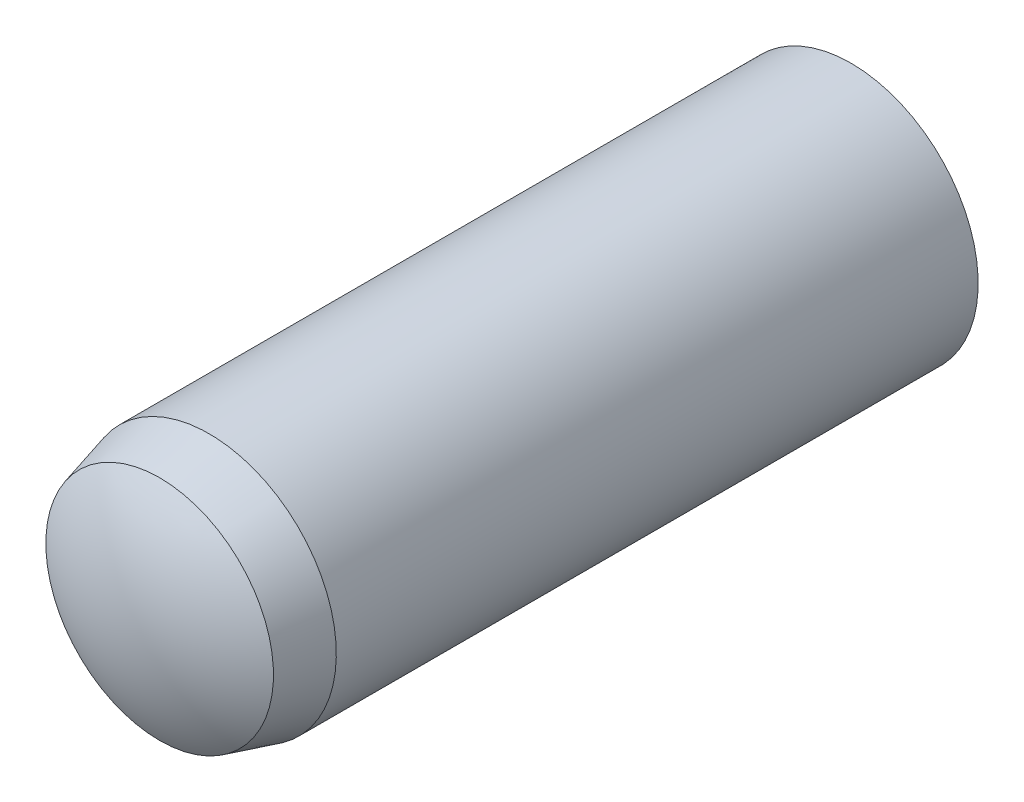
ISO-10303-21;
HEADER;
FILE_DESCRIPTION(('STEP AP214'),'2;1');
FILE_NAME('part.step','',(''),(''),'','','');
FILE_SCHEMA(('AUTOMOTIVE_DESIGN { 1 0 10303 214 1 1 1 1 }'));
ENDSEC;
DATA;
#1=APPLICATION_CONTEXT('core data for automotive mechanical design processes');
#2=APPLICATION_PROTOCOL_DEFINITION('international standard','automotive_design',2000,#1);
#3=PRODUCT_CONTEXT('',#1,'mechanical');
#4=PRODUCT('Part','Part','',(#3));
#5=PRODUCT_RELATED_PRODUCT_CATEGORY('part','',(#4));
#6=PRODUCT_DEFINITION_FORMATION('','',#4);
#7=PRODUCT_DEFINITION_CONTEXT('part definition',#1,'design');
#8=PRODUCT_DEFINITION('design','',#6,#7);
#9=PRODUCT_DEFINITION_SHAPE('','',#8);
#10=(LENGTH_UNIT() NAMED_UNIT(*) SI_UNIT(.MILLI.,.METRE.));
#11=(NAMED_UNIT(*) PLANE_ANGLE_UNIT() SI_UNIT($,.RADIAN.));
#12=(NAMED_UNIT(*) SI_UNIT($,.STERADIAN.) SOLID_ANGLE_UNIT());
#13=UNCERTAINTY_MEASURE_WITH_UNIT(LENGTH_MEASURE(1.E-05),#10,'distance_accuracy_value','');
#14=(GEOMETRIC_REPRESENTATION_CONTEXT(3) GLOBAL_UNCERTAINTY_ASSIGNED_CONTEXT((#13)) GLOBAL_UNIT_ASSIGNED_CONTEXT((#10,
#11,#12)) REPRESENTATION_CONTEXT('',''));
#15=CARTESIAN_POINT('',(0.,0.,0.));
#16=DIRECTION('',(0.,0.,1.));
#17=DIRECTION('',(1.,0.,0.));
#18=AXIS2_PLACEMENT_3D('',#15,#16,#17);
#19=CARTESIAN_POINT('',(0.,0.,-1.18333333333333));
#20=DIRECTION('',(0.,0.,1.));
#21=DIRECTION('',(0.,1.,0.));
#22=AXIS2_PLACEMENT_3D('',#19,#20,#21);
#23=SPHERICAL_SURFACE('',#22,1.81666666666667);
#24=CARTESIAN_POINT('',(0.,0.,-2.7));
#25=DIRECTION('',(0.,0.,1.));
#26=DIRECTION('',(0.,-1.,0.));
#27=AXIS2_PLACEMENT_3D('',#24,#25,#26);
#28=CIRCLE('',#27,0.999999999999999);
#29=CARTESIAN_POINT('',(0.,-0.999999999999999,-2.7));
#30=VERTEX_POINT('',#29);
#31=EDGE_CURVE('E10',#30,#30,#28,.T.);
#32=ORIENTED_EDGE('',*,*,#31,.F.);
#33=EDGE_LOOP('',(#32));
#34=FACE_BOUND('',#33,.T.);
#35=ADVANCED_FACE('F43',(#34),#23,.T.);
#36=CARTESIAN_POINT('',(0.,0.,3.));
#37=DIRECTION('',(0.,0.,1.));
#38=DIRECTION('',(0.,-1.,0.));
#39=AXIS2_PLACEMENT_3D('',#36,#37,#38);
#40=CYLINDRICAL_SURFACE('',#39,1.);
#41=CARTESIAN_POINT('',(0.,0.,2.35));
#42=DIRECTION('',(0.,0.,1.));
#43=DIRECTION('',(0.,-1.,0.));
#44=AXIS2_PLACEMENT_3D('',#41,#42,#43);
#45=CIRCLE('',#44,1.);
#46=CARTESIAN_POINT('',(0.,-1.,2.35));
#47=VERTEX_POINT('',#46);
#48=EDGE_CURVE('E50',#47,#47,#45,.T.);
#49=ORIENTED_EDGE('',*,*,#48,.F.);
#50=EDGE_LOOP('',(#49));
#51=FACE_BOUND('',#50,.T.);
#52=ORIENTED_EDGE('',*,*,#31,.T.);
#53=EDGE_LOOP('',(#52));
#54=FACE_BOUND('',#53,.T.);
#55=ADVANCED_FACE('F67',(#51,#54),#40,.T.);
#56=CARTESIAN_POINT('',(0.,0.,2.35));
#57=DIRECTION('',(0.,0.,-1.));
#58=DIRECTION('',(0.,1.,0.));
#59=AXIS2_PLACEMENT_3D('',#56,#57,#58);
#60=CONICAL_SURFACE('',#59,1.,0.26179938779915);
#61=CARTESIAN_POINT('',(0.,0.,2.74));
#62=DIRECTION('',(0.,0.,1.));
#63=DIRECTION('',(0.,-1.,0.));
#64=AXIS2_PLACEMENT_3D('',#61,#62,#63);
#65=CIRCLE('',#64,0.895499814951862);
#66=CARTESIAN_POINT('',(0.,-0.895499814951862,2.74));
#67=VERTEX_POINT('',#66);
#68=EDGE_CURVE('E55',#67,#67,#65,.T.);
#69=ORIENTED_EDGE('',*,*,#68,.F.);
#70=EDGE_LOOP('',(#69));
#71=FACE_BOUND('',#70,.T.);
#72=ORIENTED_EDGE('',*,*,#48,.T.);
#73=EDGE_LOOP('',(#72));
#74=FACE_BOUND('',#73,.T.);
#75=ADVANCED_FACE('F65',(#71,#74),#60,.T.);
#76=CARTESIAN_POINT('',(0.,0.,1.32784631042535));
#77=DIRECTION('',(0.,0.,1.));
#78=DIRECTION('',(0.,1.,0.));
#79=AXIS2_PLACEMENT_3D('',#76,#77,#78);
#80=SPHERICAL_SURFACE('',#79,1.67215368957465);
#81=ORIENTED_EDGE('',*,*,#68,.T.);
#82=EDGE_LOOP('',(#81));
#83=FACE_BOUND('',#82,.T.);
#84=ADVANCED_FACE('F63',(#83),#80,.T.);
#85=CLOSED_SHELL('',(#35,#55,#75,#84));
#86=MANIFOLD_SOLID_BREP('B2',#85);
#87=ADVANCED_BREP_SHAPE_REPRESENTATION('',(#18,#86),#14);
#88=SHAPE_DEFINITION_REPRESENTATION(#9,#87);
ENDSEC;
END-ISO-10303-21;
